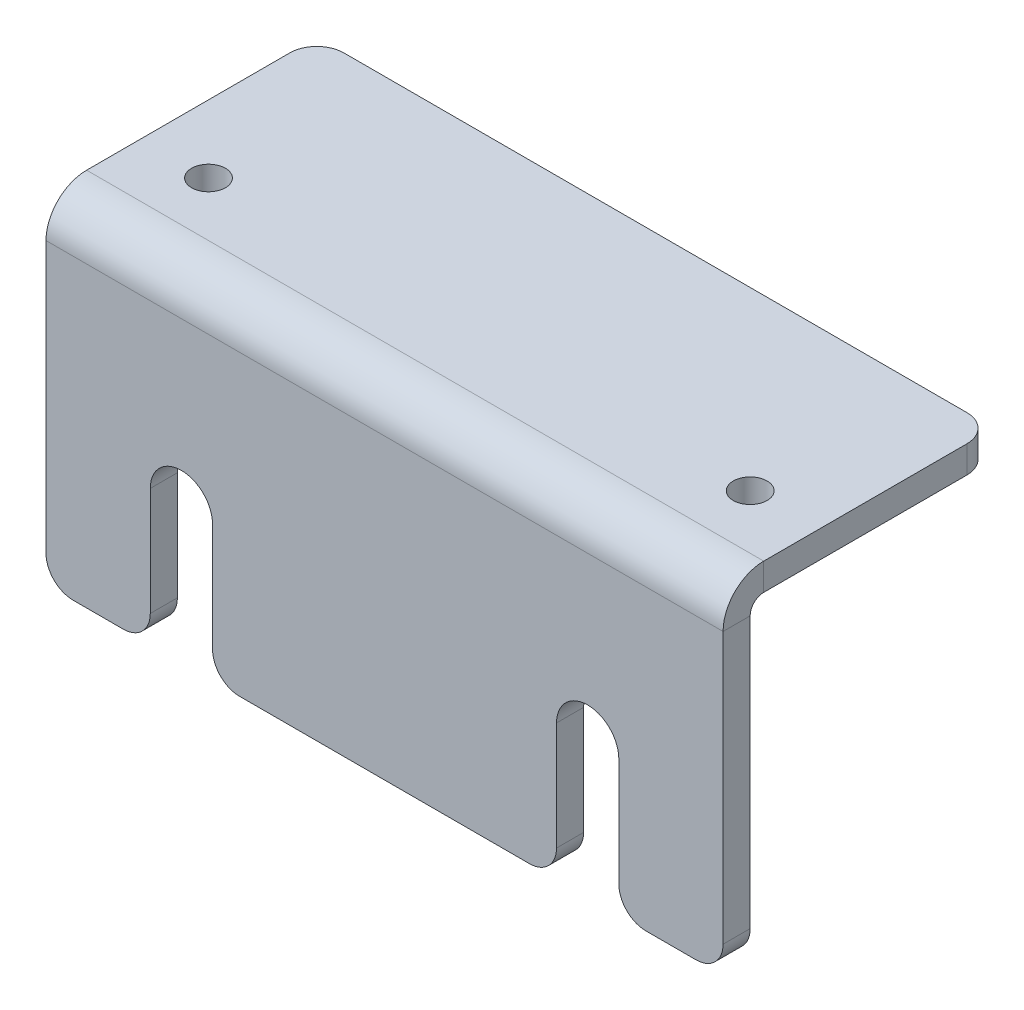
ISO-10303-21;
HEADER;
FILE_DESCRIPTION(('STEP AP214'),'2;1');
FILE_NAME('part.step','',(''),(''),'','','');
FILE_SCHEMA(('AUTOMOTIVE_DESIGN { 1 0 10303 214 1 1 1 1 }'));
ENDSEC;
DATA;
#1=APPLICATION_CONTEXT('core data for automotive mechanical design processes');
#2=APPLICATION_PROTOCOL_DEFINITION('international standard','automotive_design',2000,#1);
#3=PRODUCT_CONTEXT('',#1,'mechanical');
#4=PRODUCT('Part','Part','',(#3));
#5=PRODUCT_RELATED_PRODUCT_CATEGORY('part','',(#4));
#6=PRODUCT_DEFINITION_FORMATION('','',#4);
#7=PRODUCT_DEFINITION_CONTEXT('part definition',#1,'design');
#8=PRODUCT_DEFINITION('design','',#6,#7);
#9=PRODUCT_DEFINITION_SHAPE('','',#8);
#10=(LENGTH_UNIT() NAMED_UNIT(*) SI_UNIT(.MILLI.,.METRE.));
#11=(NAMED_UNIT(*) PLANE_ANGLE_UNIT() SI_UNIT($,.RADIAN.));
#12=(NAMED_UNIT(*) SI_UNIT($,.STERADIAN.) SOLID_ANGLE_UNIT());
#13=UNCERTAINTY_MEASURE_WITH_UNIT(LENGTH_MEASURE(1.E-05),#10,'distance_accuracy_value','');
#14=(GEOMETRIC_REPRESENTATION_CONTEXT(3) GLOBAL_UNCERTAINTY_ASSIGNED_CONTEXT((#13)) GLOBAL_UNIT_ASSIGNED_CONTEXT((#10,
#11,#12)) REPRESENTATION_CONTEXT('',''));
#15=CARTESIAN_POINT('',(0.,0.,0.));
#16=DIRECTION('',(0.,0.,1.));
#17=DIRECTION('',(1.,0.,0.));
#18=AXIS2_PLACEMENT_3D('',#15,#16,#17);
#19=CARTESIAN_POINT('',(-25.,-93.1219674120872,0.));
#20=DIRECTION('',(0.,0.,1.));
#21=DIRECTION('',(0.,-1.,0.));
#22=AXIS2_PLACEMENT_3D('',#19,#20,#21);
#23=PLANE('',#22);
#24=DIRECTION('',(0.,1.,0.));
#25=VECTOR('',#24,1.);
#26=CARTESIAN_POINT('',(-23.,-93.1219674120872,0.));
#27=LINE('',#26,#25);
#28=CARTESIAN_POINT('',(-23.,10.5,0.));
#29=VERTEX_POINT('',#28);
#30=CARTESIAN_POINT('',(-23.,12.5,0.));
#31=VERTEX_POINT('',#30);
#32=EDGE_CURVE('E283',#29,#31,#27,.T.);
#33=ORIENTED_EDGE('',*,*,#32,.T.);
#34=DIRECTION('',(1.,0.,0.));
#35=VECTOR('',#34,1.);
#36=CARTESIAN_POINT('',(-25.,12.5,0.));
#37=LINE('',#36,#35);
#38=CARTESIAN_POINT('',(23.,12.5,0.));
#39=VERTEX_POINT('',#38);
#40=EDGE_CURVE('E308',#31,#39,#37,.T.);
#41=ORIENTED_EDGE('',*,*,#40,.T.);
#42=DIRECTION('',(0.,1.,0.));
#43=VECTOR('',#42,1.);
#44=CARTESIAN_POINT('',(23.,-93.1219674120872,0.));
#45=LINE('',#44,#43);
#46=CARTESIAN_POINT('',(23.,10.5,0.));
#47=VERTEX_POINT('',#46);
#48=EDGE_CURVE('E313',#47,#39,#45,.T.);
#49=ORIENTED_EDGE('',*,*,#48,.F.);
#50=DIRECTION('',(1.,0.,0.));
#51=VECTOR('',#50,1.);
#52=CARTESIAN_POINT('',(-25.,10.5,0.));
#53=LINE('',#52,#51);
#54=EDGE_CURVE('E441',#29,#47,#53,.T.);
#55=ORIENTED_EDGE('',*,*,#54,.F.);
#56=EDGE_LOOP('',(#33,#41,#49,#55));
#57=FACE_BOUND('',#56,.T.);
#58=ADVANCED_FACE('F47',(#57),#23,.F.);
#59=CARTESIAN_POINT('',(23.,-93.1219674120872,2.00000000000001));
#60=DIRECTION('',(0.,1.,0.));
#61=DIRECTION('',(0.,0.,1.));
#62=AXIS2_PLACEMENT_3D('',#59,#60,#61);
#63=CYLINDRICAL_SURFACE('',#62,2.);
#64=ORIENTED_EDGE('',*,*,#48,.T.);
#65=CARTESIAN_POINT('',(23.,12.5,2.00000000000001));
#66=DIRECTION('',(0.,-1.,0.));
#67=DIRECTION('',(0.,0.,-1.));
#68=AXIS2_PLACEMENT_3D('',#65,#66,#67);
#69=CIRCLE('',#68,2.);
#70=CARTESIAN_POINT('',(25.,12.5,2.00000000000001));
#71=VERTEX_POINT('',#70);
#72=EDGE_CURVE('E640',#39,#71,#69,.T.);
#73=ORIENTED_EDGE('',*,*,#72,.T.);
#74=DIRECTION('',(0.,1.,0.));
#75=VECTOR('',#74,1.);
#76=CARTESIAN_POINT('',(25.,-93.1219674120872,2.00000000000001));
#77=LINE('',#76,#75);
#78=CARTESIAN_POINT('',(25.,10.5,2.00000000000001));
#79=VERTEX_POINT('',#78);
#80=EDGE_CURVE('E329',#79,#71,#77,.T.);
#81=ORIENTED_EDGE('',*,*,#80,.F.);
#82=CARTESIAN_POINT('',(23.,10.5,2.00000000000001));
#83=DIRECTION('',(0.,-1.,0.));
#84=DIRECTION('',(0.,0.,-1.));
#85=AXIS2_PLACEMENT_3D('',#82,#83,#84);
#86=CIRCLE('',#85,2.);
#87=EDGE_CURVE('E436',#47,#79,#86,.T.);
#88=ORIENTED_EDGE('',*,*,#87,.F.);
#89=EDGE_LOOP('',(#64,#73,#81,#88));
#90=FACE_BOUND('',#89,.T.);
#91=ADVANCED_FACE('F660',(#90),#63,.T.);
#92=CARTESIAN_POINT('',(20.,12.5,13.));
#93=DIRECTION('',(0.,1.,0.));
#94=DIRECTION('',(0.,0.,1.));
#95=AXIS2_PLACEMENT_3D('',#92,#93,#94);
#96=CYLINDRICAL_SURFACE('',#95,1.25);
#97=CARTESIAN_POINT('',(20.,12.5,13.));
#98=DIRECTION('',(0.,1.,0.));
#99=DIRECTION('',(0.,0.,1.));
#100=AXIS2_PLACEMENT_3D('',#97,#98,#99);
#101=CIRCLE('',#100,1.25);
#102=CARTESIAN_POINT('',(20.,12.5,14.25));
#103=VERTEX_POINT('',#102);
#104=EDGE_CURVE('E346',#103,#103,#101,.T.);
#105=ORIENTED_EDGE('',*,*,#104,.T.);
#106=EDGE_LOOP('',(#105));
#107=FACE_BOUND('',#106,.T.);
#108=CARTESIAN_POINT('',(20.,10.5,13.));
#109=DIRECTION('',(0.,1.,0.));
#110=DIRECTION('',(0.,0.,1.));
#111=AXIS2_PLACEMENT_3D('',#108,#109,#110);
#112=CIRCLE('',#111,1.25);
#113=CARTESIAN_POINT('',(20.,10.5,14.25));
#114=VERTEX_POINT('',#113);
#115=EDGE_CURVE('E328',#114,#114,#112,.T.);
#116=ORIENTED_EDGE('',*,*,#115,.F.);
#117=EDGE_LOOP('',(#116));
#118=FACE_BOUND('',#117,.T.);
#119=ADVANCED_FACE('F646',(#107,#118),#96,.F.);
#120=CARTESIAN_POINT('',(-20.,12.5,13.));
#121=DIRECTION('',(0.,1.,0.));
#122=DIRECTION('',(0.,0.,1.));
#123=AXIS2_PLACEMENT_3D('',#120,#121,#122);
#124=CYLINDRICAL_SURFACE('',#123,1.25);
#125=CARTESIAN_POINT('',(-20.,12.5,13.));
#126=DIRECTION('',(0.,1.,0.));
#127=DIRECTION('',(0.,0.,1.));
#128=AXIS2_PLACEMENT_3D('',#125,#126,#127);
#129=CIRCLE('',#128,1.25);
#130=CARTESIAN_POINT('',(-20.,12.5,14.25));
#131=VERTEX_POINT('',#130);
#132=EDGE_CURVE('E341',#131,#131,#129,.T.);
#133=ORIENTED_EDGE('',*,*,#132,.T.);
#134=EDGE_LOOP('',(#133));
#135=FACE_BOUND('',#134,.T.);
#136=CARTESIAN_POINT('',(-20.,10.5,13.));
#137=DIRECTION('',(0.,1.,0.));
#138=DIRECTION('',(0.,0.,1.));
#139=AXIS2_PLACEMENT_3D('',#136,#137,#138);
#140=CIRCLE('',#139,1.25);
#141=CARTESIAN_POINT('',(-20.,10.5,14.25));
#142=VERTEX_POINT('',#141);
#143=EDGE_CURVE('E323',#142,#142,#140,.T.);
#144=ORIENTED_EDGE('',*,*,#143,.F.);
#145=EDGE_LOOP('',(#144));
#146=FACE_BOUND('',#145,.T.);
#147=ADVANCED_FACE('F672',(#135,#146),#124,.F.);
#148=CARTESIAN_POINT('',(-23.,-93.1219674120872,2.00000000000001));
#149=DIRECTION('',(0.,1.,0.));
#150=DIRECTION('',(0.,0.,1.));
#151=AXIS2_PLACEMENT_3D('',#148,#149,#150);
#152=CYLINDRICAL_SURFACE('',#151,2.);
#153=DIRECTION('',(0.,1.,0.));
#154=VECTOR('',#153,1.);
#155=CARTESIAN_POINT('',(-25.,-93.1219674120872,2.00000000000001));
#156=LINE('',#155,#154);
#157=CARTESIAN_POINT('',(-25.,10.5,2.00000000000001));
#158=VERTEX_POINT('',#157);
#159=CARTESIAN_POINT('',(-25.,12.5,2.00000000000001));
#160=VERTEX_POINT('',#159);
#161=EDGE_CURVE('E338',#158,#160,#156,.T.);
#162=ORIENTED_EDGE('',*,*,#161,.T.);
#163=CARTESIAN_POINT('',(-23.,12.5,2.00000000000001));
#164=DIRECTION('',(0.,1.,0.));
#165=DIRECTION('',(0.,0.,1.));
#166=AXIS2_PLACEMENT_3D('',#163,#164,#165);
#167=CIRCLE('',#166,2.);
#168=EDGE_CURVE('E264',#160,#31,#167,.F.);
#169=ORIENTED_EDGE('',*,*,#168,.T.);
#170=ORIENTED_EDGE('',*,*,#32,.F.);
#171=CARTESIAN_POINT('',(-23.,10.5,2.00000000000001));
#172=DIRECTION('',(0.,1.,0.));
#173=DIRECTION('',(0.,0.,1.));
#174=AXIS2_PLACEMENT_3D('',#171,#172,#173);
#175=CIRCLE('',#174,2.);
#176=EDGE_CURVE('E447',#158,#29,#175,.F.);
#177=ORIENTED_EDGE('',*,*,#176,.F.);
#178=EDGE_LOOP('',(#162,#169,#170,#177));
#179=FACE_BOUND('',#178,.T.);
#180=ADVANCED_FACE('F458',(#179),#152,.T.);
#181=CARTESIAN_POINT('',(-25.,-93.1219674120872,20.));
#182=DIRECTION('',(1.,0.,0.));
#183=DIRECTION('',(0.,-1.,0.));
#184=AXIS2_PLACEMENT_3D('',#181,#182,#183);
#185=PLANE('',#184);
#186=DIRECTION('',(0.,1.,0.));
#187=VECTOR('',#186,1.);
#188=CARTESIAN_POINT('',(-25.,-93.1219674120872,17.));
#189=LINE('',#188,#187);
#190=CARTESIAN_POINT('',(-25.,10.5,17.));
#191=VERTEX_POINT('',#190);
#192=CARTESIAN_POINT('',(-25.,12.5,17.));
#193=VERTEX_POINT('',#192);
#194=EDGE_CURVE('E255',#191,#193,#189,.T.);
#195=ORIENTED_EDGE('',*,*,#194,.T.);
#196=DIRECTION('',(0.,0.,-1.));
#197=VECTOR('',#196,1.);
#198=CARTESIAN_POINT('',(-25.,12.5,20.));
#199=LINE('',#198,#197);
#200=EDGE_CURVE('E258',#160,#193,#199,.F.);
#201=ORIENTED_EDGE('',*,*,#200,.F.);
#202=ORIENTED_EDGE('',*,*,#161,.F.);
#203=DIRECTION('',(0.,0.,-1.));
#204=VECTOR('',#203,1.);
#205=CARTESIAN_POINT('',(-25.,10.5,20.));
#206=LINE('',#205,#204);
#207=EDGE_CURVE('E107',#191,#158,#206,.T.);
#208=ORIENTED_EDGE('',*,*,#207,.F.);
#209=EDGE_LOOP('',(#195,#201,#202,#208));
#210=FACE_BOUND('',#209,.T.);
#211=ADVANCED_FACE('F257',(#210),#185,.F.);
#212=CARTESIAN_POINT('',(-25.,12.5,20.));
#213=DIRECTION('',(0.,-1.,0.));
#214=DIRECTION('',(0.,0.,-1.));
#215=AXIS2_PLACEMENT_3D('',#212,#213,#214);
#216=PLANE('',#215);
#217=ORIENTED_EDGE('',*,*,#132,.F.);
#218=EDGE_LOOP('',(#217));
#219=FACE_BOUND('',#218,.T.);
#220=ORIENTED_EDGE('',*,*,#104,.F.);
#221=EDGE_LOOP('',(#220));
#222=FACE_BOUND('',#221,.T.);
#223=ORIENTED_EDGE('',*,*,#200,.T.);
#224=DIRECTION('',(-1.,0.,0.));
#225=VECTOR('',#224,1.);
#226=CARTESIAN_POINT('',(0.,12.5,17.));
#227=LINE('',#226,#225);
#228=CARTESIAN_POINT('',(25.,12.5,17.));
#229=VERTEX_POINT('',#228);
#230=EDGE_CURVE('E269',#229,#193,#227,.T.);
#231=ORIENTED_EDGE('',*,*,#230,.F.);
#232=DIRECTION('',(0.,0.,1.));
#233=VECTOR('',#232,1.);
#234=CARTESIAN_POINT('',(25.,12.5,20.));
#235=LINE('',#234,#233);
#236=EDGE_CURVE('E272',#229,#71,#235,.F.);
#237=ORIENTED_EDGE('',*,*,#236,.T.);
#238=ORIENTED_EDGE('',*,*,#72,.F.);
#239=ORIENTED_EDGE('',*,*,#40,.F.);
#240=ORIENTED_EDGE('',*,*,#168,.F.);
#241=EDGE_LOOP('',(#223,#231,#237,#238,#239,#240));
#242=FACE_BOUND('',#241,.T.);
#243=ADVANCED_FACE('F268',(#219,#222,#242),#216,.F.);
#244=CARTESIAN_POINT('',(25.,-93.1219674120872,20.));
#245=DIRECTION('',(-1.,0.,0.));
#246=DIRECTION('',(0.,1.,0.));
#247=AXIS2_PLACEMENT_3D('',#244,#245,#246);
#248=PLANE('',#247);
#249=ORIENTED_EDGE('',*,*,#80,.T.);
#250=ORIENTED_EDGE('',*,*,#236,.F.);
#251=DIRECTION('',(0.,1.,0.));
#252=VECTOR('',#251,1.);
#253=CARTESIAN_POINT('',(25.,-93.1219674120872,17.));
#254=LINE('',#253,#252);
#255=CARTESIAN_POINT('',(25.,10.5,17.));
#256=VERTEX_POINT('',#255);
#257=EDGE_CURVE('E51',#256,#229,#254,.T.);
#258=ORIENTED_EDGE('',*,*,#257,.F.);
#259=DIRECTION('',(0.,0.,1.));
#260=VECTOR('',#259,1.);
#261=CARTESIAN_POINT('',(25.,10.5,20.));
#262=LINE('',#261,#260);
#263=EDGE_CURVE('E58',#79,#256,#262,.T.);
#264=ORIENTED_EDGE('',*,*,#263,.F.);
#265=EDGE_LOOP('',(#249,#250,#258,#264));
#266=FACE_BOUND('',#265,.T.);
#267=ADVANCED_FACE('F650',(#266),#248,.F.);
#268=CARTESIAN_POINT('',(-25.,10.5,20.));
#269=DIRECTION('',(0.,-1.,0.));
#270=DIRECTION('',(0.,0.,-1.));
#271=AXIS2_PLACEMENT_3D('',#268,#269,#270);
#272=PLANE('',#271);
#273=ORIENTED_EDGE('',*,*,#143,.T.);
#274=EDGE_LOOP('',(#273));
#275=FACE_BOUND('',#274,.T.);
#276=ORIENTED_EDGE('',*,*,#115,.T.);
#277=EDGE_LOOP('',(#276));
#278=FACE_BOUND('',#277,.T.);
#279=ORIENTED_EDGE('',*,*,#207,.T.);
#280=ORIENTED_EDGE('',*,*,#176,.T.);
#281=ORIENTED_EDGE('',*,*,#54,.T.);
#282=ORIENTED_EDGE('',*,*,#87,.T.);
#283=ORIENTED_EDGE('',*,*,#263,.T.);
#284=DIRECTION('',(1.,0.,0.));
#285=VECTOR('',#284,1.);
#286=CARTESIAN_POINT('',(-25.,10.5,17.));
#287=LINE('',#286,#285);
#288=EDGE_CURVE('E12',#256,#191,#287,.F.);
#289=ORIENTED_EDGE('',*,*,#288,.T.);
#290=EDGE_LOOP('',(#279,#280,#281,#282,#283,#289));
#291=FACE_BOUND('',#290,.T.);
#292=ADVANCED_FACE('F49',(#275,#278,#291),#272,.T.);
#293=CARTESIAN_POINT('',(0.,0.,18.));
#294=DIRECTION('',(0.,0.,-1.));
#295=DIRECTION('',(-1.,0.,0.));
#296=AXIS2_PLACEMENT_3D('',#293,#294,#295);
#297=PLANE('',#296);
#298=DIRECTION('',(0.,1.,0.));
#299=VECTOR('',#298,1.);
#300=CARTESIAN_POINT('',(-25.,-12.5,18.));
#301=LINE('',#300,#299);
#302=CARTESIAN_POINT('',(-25.,-10.5,18.));
#303=VERTEX_POINT('',#302);
#304=CARTESIAN_POINT('',(-25.,9.5,18.));
#305=VERTEX_POINT('',#304);
#306=EDGE_CURVE('E475',#303,#305,#301,.T.);
#307=ORIENTED_EDGE('',*,*,#306,.T.);
#308=DIRECTION('',(-1.,0.,0.));
#309=VECTOR('',#308,1.);
#310=CARTESIAN_POINT('',(0.,9.5,18.));
#311=LINE('',#310,#309);
#312=CARTESIAN_POINT('',(25.,9.5,18.));
#313=VERTEX_POINT('',#312);
#314=EDGE_CURVE('E470',#305,#313,#311,.F.);
#315=ORIENTED_EDGE('',*,*,#314,.T.);
#316=DIRECTION('',(0.,1.,0.));
#317=VECTOR('',#316,1.);
#318=CARTESIAN_POINT('',(25.,-12.5,18.));
#319=LINE('',#318,#317);
#320=CARTESIAN_POINT('',(25.,-10.5,18.));
#321=VERTEX_POINT('',#320);
#322=EDGE_CURVE('E472',#313,#321,#319,.F.);
#323=ORIENTED_EDGE('',*,*,#322,.T.);
#324=CARTESIAN_POINT('',(23.,-10.5,18.));
#325=DIRECTION('',(0.,0.,-1.));
#326=DIRECTION('',(-1.,0.,0.));
#327=AXIS2_PLACEMENT_3D('',#324,#325,#326);
#328=CIRCLE('',#327,2.);
#329=CARTESIAN_POINT('',(23.,-12.5,18.));
#330=VERTEX_POINT('',#329);
#331=EDGE_CURVE('E480',#330,#321,#328,.F.);
#332=ORIENTED_EDGE('',*,*,#331,.F.);
#333=DIRECTION('',(1.,0.,0.));
#334=VECTOR('',#333,1.);
#335=CARTESIAN_POINT('',(-25.,-12.5,18.));
#336=LINE('',#335,#334);
#337=CARTESIAN_POINT('',(19.3,-12.5,18.));
#338=VERTEX_POINT('',#337);
#339=EDGE_CURVE('E483',#330,#338,#336,.F.);
#340=ORIENTED_EDGE('',*,*,#339,.T.);
#341=CARTESIAN_POINT('',(19.3,-10.5,18.));
#342=DIRECTION('',(0.,0.,-1.));
#343=DIRECTION('',(-1.,0.,0.));
#344=AXIS2_PLACEMENT_3D('',#341,#342,#343);
#345=CIRCLE('',#344,2.);
#346=CARTESIAN_POINT('',(17.3,-10.5,18.));
#347=VERTEX_POINT('',#346);
#348=EDGE_CURVE('E489',#347,#338,#345,.F.);
#349=ORIENTED_EDGE('',*,*,#348,.F.);
#350=DIRECTION('',(0.,1.,0.));
#351=VECTOR('',#350,1.);
#352=CARTESIAN_POINT('',(17.3,-22.5,18.));
#353=LINE('',#352,#351);
#354=CARTESIAN_POINT('',(17.3,-2.5,18.));
#355=VERTEX_POINT('',#354);
#356=EDGE_CURVE('E493',#347,#355,#353,.T.);
#357=ORIENTED_EDGE('',*,*,#356,.T.);
#358=CARTESIAN_POINT('',(15.,-2.5,18.));
#359=DIRECTION('',(0.,0.,1.));
#360=DIRECTION('',(1.,0.,0.));
#361=AXIS2_PLACEMENT_3D('',#358,#359,#360);
#362=CIRCLE('',#361,2.3);
#363=CARTESIAN_POINT('',(12.7,-2.5,18.));
#364=VERTEX_POINT('',#363);
#365=EDGE_CURVE('E497',#355,#364,#362,.T.);
#366=ORIENTED_EDGE('',*,*,#365,.T.);
#367=DIRECTION('',(0.,-1.,0.));
#368=VECTOR('',#367,1.);
#369=CARTESIAN_POINT('',(12.7,-22.5,18.));
#370=LINE('',#369,#368);
#371=CARTESIAN_POINT('',(12.7,-10.5,18.));
#372=VERTEX_POINT('',#371);
#373=EDGE_CURVE('E508',#364,#372,#370,.T.);
#374=ORIENTED_EDGE('',*,*,#373,.T.);
#375=CARTESIAN_POINT('',(10.7,-10.5,18.));
#376=DIRECTION('',(0.,0.,1.));
#377=DIRECTION('',(1.,0.,0.));
#378=AXIS2_PLACEMENT_3D('',#375,#376,#377);
#379=CIRCLE('',#378,2.);
#380=CARTESIAN_POINT('',(10.7,-12.5,18.));
#381=VERTEX_POINT('',#380);
#382=EDGE_CURVE('E511',#381,#372,#379,.T.);
#383=ORIENTED_EDGE('',*,*,#382,.F.);
#384=DIRECTION('',(1.,0.,0.));
#385=VECTOR('',#384,1.);
#386=CARTESIAN_POINT('',(-25.,-12.5,18.));
#387=LINE('',#386,#385);
#388=CARTESIAN_POINT('',(-10.7,-12.5,18.));
#389=VERTEX_POINT('',#388);
#390=EDGE_CURVE('E516',#381,#389,#387,.F.);
#391=ORIENTED_EDGE('',*,*,#390,.T.);
#392=CARTESIAN_POINT('',(-10.7,-10.5,18.));
#393=DIRECTION('',(0.,0.,-1.));
#394=DIRECTION('',(-1.,0.,0.));
#395=AXIS2_PLACEMENT_3D('',#392,#393,#394);
#396=CIRCLE('',#395,2.);
#397=CARTESIAN_POINT('',(-12.7,-10.5,18.));
#398=VERTEX_POINT('',#397);
#399=EDGE_CURVE('E519',#398,#389,#396,.F.);
#400=ORIENTED_EDGE('',*,*,#399,.F.);
#401=DIRECTION('',(0.,1.,0.));
#402=VECTOR('',#401,1.);
#403=CARTESIAN_POINT('',(-12.7,-22.5,18.));
#404=LINE('',#403,#402);
#405=CARTESIAN_POINT('',(-12.7,-2.50000000000001,18.));
#406=VERTEX_POINT('',#405);
#407=EDGE_CURVE('E523',#398,#406,#404,.T.);
#408=ORIENTED_EDGE('',*,*,#407,.T.);
#409=CARTESIAN_POINT('',(-15.,-2.50000000000001,18.));
#410=DIRECTION('',(0.,0.,1.));
#411=DIRECTION('',(1.,0.,0.));
#412=AXIS2_PLACEMENT_3D('',#409,#410,#411);
#413=CIRCLE('',#412,2.29999999999999);
#414=CARTESIAN_POINT('',(-17.3,-2.50000000000001,18.));
#415=VERTEX_POINT('',#414);
#416=EDGE_CURVE('E526',#406,#415,#413,.T.);
#417=ORIENTED_EDGE('',*,*,#416,.T.);
#418=DIRECTION('',(0.,1.,0.));
#419=VECTOR('',#418,1.);
#420=CARTESIAN_POINT('',(-17.3,-22.5,18.));
#421=LINE('',#420,#419);
#422=CARTESIAN_POINT('',(-17.3,-10.5,18.));
#423=VERTEX_POINT('',#422);
#424=EDGE_CURVE('E361',#415,#423,#421,.F.);
#425=ORIENTED_EDGE('',*,*,#424,.T.);
#426=CARTESIAN_POINT('',(-19.3,-10.5,18.));
#427=DIRECTION('',(0.,0.,1.));
#428=DIRECTION('',(1.,0.,0.));
#429=AXIS2_PLACEMENT_3D('',#426,#427,#428);
#430=CIRCLE('',#429,2.);
#431=CARTESIAN_POINT('',(-19.3,-12.5,18.));
#432=VERTEX_POINT('',#431);
#433=EDGE_CURVE('E354',#432,#423,#430,.T.);
#434=ORIENTED_EDGE('',*,*,#433,.F.);
#435=DIRECTION('',(1.,0.,0.));
#436=VECTOR('',#435,1.);
#437=CARTESIAN_POINT('',(-25.,-12.5,18.));
#438=LINE('',#437,#436);
#439=CARTESIAN_POINT('',(-23.,-12.5,18.));
#440=VERTEX_POINT('',#439);
#441=EDGE_CURVE('E360',#432,#440,#438,.F.);
#442=ORIENTED_EDGE('',*,*,#441,.T.);
#443=CARTESIAN_POINT('',(-23.,-10.5,18.));
#444=DIRECTION('',(0.,0.,-1.));
#445=DIRECTION('',(-1.,0.,0.));
#446=AXIS2_PLACEMENT_3D('',#443,#444,#445);
#447=CIRCLE('',#446,2.);
#448=EDGE_CURVE('E364',#303,#440,#447,.F.);
#449=ORIENTED_EDGE('',*,*,#448,.F.);
#450=EDGE_LOOP('',(#307,#315,#323,#332,#340,#349,#357,#366,#374,#383,#391,#400,#408,#417,#425,
#434,#442,#449));
#451=FACE_BOUND('',#450,.T.);
#452=ADVANCED_FACE('F471',(#451),#297,.T.);
#453=CARTESIAN_POINT('',(-25.,-12.5,-89.2520022699813));
#454=DIRECTION('',(1.,0.,0.));
#455=DIRECTION('',(0.,0.,-1.));
#456=AXIS2_PLACEMENT_3D('',#453,#454,#455);
#457=PLANE('',#456);
#458=DIRECTION('',(0.,0.,1.));
#459=VECTOR('',#458,1.);
#460=CARTESIAN_POINT('',(-25.,-10.5,-89.2520022699813));
#461=LINE('',#460,#459);
#462=CARTESIAN_POINT('',(-25.,-10.5,20.));
#463=VERTEX_POINT('',#462);
#464=EDGE_CURVE('E368',#303,#463,#461,.T.);
#465=ORIENTED_EDGE('',*,*,#464,.T.);
#466=DIRECTION('',(0.,1.,0.));
#467=VECTOR('',#466,1.);
#468=CARTESIAN_POINT('',(-25.,0.,20.));
#469=LINE('',#468,#467);
#470=CARTESIAN_POINT('',(-25.,9.5,20.));
#471=VERTEX_POINT('',#470);
#472=EDGE_CURVE('E605',#463,#471,#469,.T.);
#473=ORIENTED_EDGE('',*,*,#472,.T.);
#474=DIRECTION('',(0.,0.,1.));
#475=VECTOR('',#474,1.);
#476=CARTESIAN_POINT('',(-25.,9.5,-89.2520022699813));
#477=LINE('',#476,#475);
#478=EDGE_CURVE('E286',#305,#471,#477,.T.);
#479=ORIENTED_EDGE('',*,*,#478,.F.);
#480=ORIENTED_EDGE('',*,*,#306,.F.);
#481=EDGE_LOOP('',(#465,#473,#479,#480));
#482=FACE_BOUND('',#481,.T.);
#483=ADVANCED_FACE('F628',(#482),#457,.F.);
#484=CARTESIAN_POINT('',(25.,-12.5,-89.2520022699813));
#485=DIRECTION('',(-1.,0.,0.));
#486=DIRECTION('',(0.,0.,1.));
#487=AXIS2_PLACEMENT_3D('',#484,#485,#486);
#488=PLANE('',#487);
#489=DIRECTION('',(0.,0.,1.));
#490=VECTOR('',#489,1.);
#491=CARTESIAN_POINT('',(25.,9.5,-89.2520022699813));
#492=LINE('',#491,#490);
#493=CARTESIAN_POINT('',(25.,9.5,20.));
#494=VERTEX_POINT('',#493);
#495=EDGE_CURVE('E429',#313,#494,#492,.T.);
#496=ORIENTED_EDGE('',*,*,#495,.T.);
#497=DIRECTION('',(0.,1.,0.));
#498=VECTOR('',#497,1.);
#499=CARTESIAN_POINT('',(25.,0.,20.));
#500=LINE('',#499,#498);
#501=CARTESIAN_POINT('',(25.,-10.5,20.));
#502=VERTEX_POINT('',#501);
#503=EDGE_CURVE('E117',#494,#502,#500,.F.);
#504=ORIENTED_EDGE('',*,*,#503,.T.);
#505=DIRECTION('',(0.,0.,1.));
#506=VECTOR('',#505,1.);
#507=CARTESIAN_POINT('',(25.,-10.5,-89.2520022699813));
#508=LINE('',#507,#506);
#509=EDGE_CURVE('E426',#321,#502,#508,.T.);
#510=ORIENTED_EDGE('',*,*,#509,.F.);
#511=ORIENTED_EDGE('',*,*,#322,.F.);
#512=EDGE_LOOP('',(#496,#504,#510,#511));
#513=FACE_BOUND('',#512,.T.);
#514=ADVANCED_FACE('F478',(#513),#488,.F.);
#515=CARTESIAN_POINT('',(23.,-10.5,-89.2520022699813));
#516=DIRECTION('',(0.,0.,1.));
#517=DIRECTION('',(1.,0.,0.));
#518=AXIS2_PLACEMENT_3D('',#515,#516,#517);
#519=CYLINDRICAL_SURFACE('',#518,2.);
#520=CARTESIAN_POINT('',(23.,-10.5,20.));
#521=DIRECTION('',(0.,0.,-1.));
#522=DIRECTION('',(-1.,0.,0.));
#523=AXIS2_PLACEMENT_3D('',#520,#521,#522);
#524=CIRCLE('',#523,2.);
#525=CARTESIAN_POINT('',(23.,-12.5,20.));
#526=VERTEX_POINT('',#525);
#527=EDGE_CURVE('E125',#502,#526,#524,.T.);
#528=ORIENTED_EDGE('',*,*,#527,.T.);
#529=DIRECTION('',(0.,0.,1.));
#530=VECTOR('',#529,1.);
#531=CARTESIAN_POINT('',(23.,-12.5,-89.2520022699813));
#532=LINE('',#531,#530);
#533=EDGE_CURVE('E423',#330,#526,#532,.T.);
#534=ORIENTED_EDGE('',*,*,#533,.F.);
#535=ORIENTED_EDGE('',*,*,#331,.T.);
#536=ORIENTED_EDGE('',*,*,#509,.T.);
#537=EDGE_LOOP('',(#528,#534,#535,#536));
#538=FACE_BOUND('',#537,.T.);
#539=ADVANCED_FACE('F727',(#538),#519,.T.);
#540=CARTESIAN_POINT('',(-25.,-12.5,-89.2520022699813));
#541=DIRECTION('',(0.,1.,0.));
#542=DIRECTION('',(0.,0.,1.));
#543=AXIS2_PLACEMENT_3D('',#540,#541,#542);
#544=PLANE('',#543);
#545=ORIENTED_EDGE('',*,*,#533,.T.);
#546=DIRECTION('',(-1.,0.,0.));
#547=VECTOR('',#546,1.);
#548=CARTESIAN_POINT('',(0.,-12.5,20.));
#549=LINE('',#548,#547);
#550=CARTESIAN_POINT('',(19.3,-12.5,20.));
#551=VERTEX_POINT('',#550);
#552=EDGE_CURVE('E593',#526,#551,#549,.T.);
#553=ORIENTED_EDGE('',*,*,#552,.T.);
#554=DIRECTION('',(0.,0.,1.));
#555=VECTOR('',#554,1.);
#556=CARTESIAN_POINT('',(19.3,-12.5,-89.2520022699813));
#557=LINE('',#556,#555);
#558=EDGE_CURVE('E419',#338,#551,#557,.T.);
#559=ORIENTED_EDGE('',*,*,#558,.F.);
#560=ORIENTED_EDGE('',*,*,#339,.F.);
#561=EDGE_LOOP('',(#545,#553,#559,#560));
#562=FACE_BOUND('',#561,.T.);
#563=ADVANCED_FACE('F735',(#562),#544,.F.);
#564=CARTESIAN_POINT('',(19.3,-10.5,-89.2520022699813));
#565=DIRECTION('',(0.,0.,1.));
#566=DIRECTION('',(1.,0.,0.));
#567=AXIS2_PLACEMENT_3D('',#564,#565,#566);
#568=CYLINDRICAL_SURFACE('',#567,2.);
#569=CARTESIAN_POINT('',(19.3,-10.5,20.));
#570=DIRECTION('',(0.,0.,-1.));
#571=DIRECTION('',(-1.,0.,0.));
#572=AXIS2_PLACEMENT_3D('',#569,#570,#571);
#573=CIRCLE('',#572,2.);
#574=CARTESIAN_POINT('',(17.3,-10.5,20.));
#575=VERTEX_POINT('',#574);
#576=EDGE_CURVE('E590',#551,#575,#573,.T.);
#577=ORIENTED_EDGE('',*,*,#576,.T.);
#578=DIRECTION('',(0.,0.,1.));
#579=VECTOR('',#578,1.);
#580=CARTESIAN_POINT('',(17.3,-10.5,-89.2520022699813));
#581=LINE('',#580,#579);
#582=EDGE_CURVE('E415',#347,#575,#581,.T.);
#583=ORIENTED_EDGE('',*,*,#582,.F.);
#584=ORIENTED_EDGE('',*,*,#348,.T.);
#585=ORIENTED_EDGE('',*,*,#558,.T.);
#586=EDGE_LOOP('',(#577,#583,#584,#585));
#587=FACE_BOUND('',#586,.T.);
#588=ADVANCED_FACE('F744',(#587),#568,.T.);
#589=CARTESIAN_POINT('',(17.3,-22.5,-89.2520022699813));
#590=DIRECTION('',(1.,0.,0.));
#591=DIRECTION('',(0.,0.,-1.));
#592=AXIS2_PLACEMENT_3D('',#589,#590,#591);
#593=PLANE('',#592);
#594=ORIENTED_EDGE('',*,*,#582,.T.);
#595=DIRECTION('',(0.,1.,0.));
#596=VECTOR('',#595,1.);
#597=CARTESIAN_POINT('',(17.3,0.,20.));
#598=LINE('',#597,#596);
#599=CARTESIAN_POINT('',(17.3,-2.5,20.));
#600=VERTEX_POINT('',#599);
#601=EDGE_CURVE('E292',#575,#600,#598,.T.);
#602=ORIENTED_EDGE('',*,*,#601,.T.);
#603=DIRECTION('',(0.,0.,1.));
#604=VECTOR('',#603,1.);
#605=CARTESIAN_POINT('',(17.3,-2.5,-89.2520022699813));
#606=LINE('',#605,#604);
#607=EDGE_CURVE('E411',#355,#600,#606,.T.);
#608=ORIENTED_EDGE('',*,*,#607,.F.);
#609=ORIENTED_EDGE('',*,*,#356,.F.);
#610=EDGE_LOOP('',(#594,#602,#608,#609));
#611=FACE_BOUND('',#610,.T.);
#612=ADVANCED_FACE('F754',(#611),#593,.F.);
#613=CARTESIAN_POINT('',(15.,-2.5,-89.2520022699813));
#614=DIRECTION('',(0.,0.,1.));
#615=DIRECTION('',(1.,0.,0.));
#616=AXIS2_PLACEMENT_3D('',#613,#614,#615);
#617=CYLINDRICAL_SURFACE('',#616,2.3);
#618=ORIENTED_EDGE('',*,*,#607,.T.);
#619=CARTESIAN_POINT('',(15.,-2.5,20.));
#620=DIRECTION('',(0.,0.,1.));
#621=DIRECTION('',(1.,0.,0.));
#622=AXIS2_PLACEMENT_3D('',#619,#620,#621);
#623=CIRCLE('',#622,2.3);
#624=CARTESIAN_POINT('',(12.7,-2.5,20.));
#625=VERTEX_POINT('',#624);
#626=EDGE_CURVE('E578',#600,#625,#623,.T.);
#627=ORIENTED_EDGE('',*,*,#626,.T.);
#628=DIRECTION('',(0.,0.,1.));
#629=VECTOR('',#628,1.);
#630=CARTESIAN_POINT('',(12.7,-2.5,-89.2520022699813));
#631=LINE('',#630,#629);
#632=EDGE_CURVE('E407',#364,#625,#631,.T.);
#633=ORIENTED_EDGE('',*,*,#632,.F.);
#634=ORIENTED_EDGE('',*,*,#365,.F.);
#635=EDGE_LOOP('',(#618,#627,#633,#634));
#636=FACE_BOUND('',#635,.T.);
#637=ADVANCED_FACE('F764',(#636),#617,.F.);
#638=CARTESIAN_POINT('',(12.7,-22.5,-89.2520022699813));
#639=DIRECTION('',(-1.,0.,0.));
#640=DIRECTION('',(0.,-1.,0.));
#641=AXIS2_PLACEMENT_3D('',#638,#639,#640);
#642=PLANE('',#641);
#643=ORIENTED_EDGE('',*,*,#632,.T.);
#644=DIRECTION('',(0.,1.,0.));
#645=VECTOR('',#644,1.);
#646=CARTESIAN_POINT('',(12.7,0.,20.));
#647=LINE('',#646,#645);
#648=CARTESIAN_POINT('',(12.7,-10.5,20.));
#649=VERTEX_POINT('',#648);
#650=EDGE_CURVE('E576',#625,#649,#647,.F.);
#651=ORIENTED_EDGE('',*,*,#650,.T.);
#652=DIRECTION('',(0.,0.,1.));
#653=VECTOR('',#652,1.);
#654=CARTESIAN_POINT('',(12.7,-10.5,-89.2520022699813));
#655=LINE('',#654,#653);
#656=EDGE_CURVE('E403',#372,#649,#655,.T.);
#657=ORIENTED_EDGE('',*,*,#656,.F.);
#658=ORIENTED_EDGE('',*,*,#373,.F.);
#659=EDGE_LOOP('',(#643,#651,#657,#658));
#660=FACE_BOUND('',#659,.T.);
#661=ADVANCED_FACE('F774',(#660),#642,.F.);
#662=CARTESIAN_POINT('',(10.7,-10.5,-89.2520022699813));
#663=DIRECTION('',(0.,0.,1.));
#664=DIRECTION('',(1.,0.,0.));
#665=AXIS2_PLACEMENT_3D('',#662,#663,#664);
#666=CYLINDRICAL_SURFACE('',#665,2.);
#667=CARTESIAN_POINT('',(10.7,-10.5,20.));
#668=DIRECTION('',(0.,0.,1.));
#669=DIRECTION('',(1.,0.,0.));
#670=AXIS2_PLACEMENT_3D('',#667,#668,#669);
#671=CIRCLE('',#670,2.);
#672=CARTESIAN_POINT('',(10.7,-12.5,20.));
#673=VERTEX_POINT('',#672);
#674=EDGE_CURVE('E573',#649,#673,#671,.F.);
#675=ORIENTED_EDGE('',*,*,#674,.T.);
#676=DIRECTION('',(0.,0.,1.));
#677=VECTOR('',#676,1.);
#678=CARTESIAN_POINT('',(10.7,-12.5,-89.2520022699813));
#679=LINE('',#678,#677);
#680=EDGE_CURVE('E399',#381,#673,#679,.T.);
#681=ORIENTED_EDGE('',*,*,#680,.F.);
#682=ORIENTED_EDGE('',*,*,#382,.T.);
#683=ORIENTED_EDGE('',*,*,#656,.T.);
#684=EDGE_LOOP('',(#675,#681,#682,#683));
#685=FACE_BOUND('',#684,.T.);
#686=ADVANCED_FACE('F784',(#685),#666,.T.);
#687=CARTESIAN_POINT('',(-25.,-12.5,-89.2520022699813));
#688=DIRECTION('',(0.,1.,0.));
#689=DIRECTION('',(0.,0.,1.));
#690=AXIS2_PLACEMENT_3D('',#687,#688,#689);
#691=PLANE('',#690);
#692=ORIENTED_EDGE('',*,*,#680,.T.);
#693=DIRECTION('',(-1.,0.,0.));
#694=VECTOR('',#693,1.);
#695=CARTESIAN_POINT('',(0.,-12.5,20.));
#696=LINE('',#695,#694);
#697=CARTESIAN_POINT('',(-10.7,-12.5,20.));
#698=VERTEX_POINT('',#697);
#699=EDGE_CURVE('E569',#673,#698,#696,.T.);
#700=ORIENTED_EDGE('',*,*,#699,.T.);
#701=DIRECTION('',(0.,0.,1.));
#702=VECTOR('',#701,1.);
#703=CARTESIAN_POINT('',(-10.7,-12.5,-89.2520022699813));
#704=LINE('',#703,#702);
#705=EDGE_CURVE('E395',#389,#698,#704,.T.);
#706=ORIENTED_EDGE('',*,*,#705,.F.);
#707=ORIENTED_EDGE('',*,*,#390,.F.);
#708=EDGE_LOOP('',(#692,#700,#706,#707));
#709=FACE_BOUND('',#708,.T.);
#710=ADVANCED_FACE('F794',(#709),#691,.F.);
#711=CARTESIAN_POINT('',(-10.7,-10.5,-89.2520022699813));
#712=DIRECTION('',(0.,0.,1.));
#713=DIRECTION('',(1.,0.,0.));
#714=AXIS2_PLACEMENT_3D('',#711,#712,#713);
#715=CYLINDRICAL_SURFACE('',#714,2.);
#716=CARTESIAN_POINT('',(-10.7,-10.5,20.));
#717=DIRECTION('',(0.,0.,-1.));
#718=DIRECTION('',(-1.,0.,0.));
#719=AXIS2_PLACEMENT_3D('',#716,#717,#718);
#720=CIRCLE('',#719,2.);
#721=CARTESIAN_POINT('',(-12.7,-10.5,20.));
#722=VERTEX_POINT('',#721);
#723=EDGE_CURVE('E566',#698,#722,#720,.T.);
#724=ORIENTED_EDGE('',*,*,#723,.T.);
#725=DIRECTION('',(0.,0.,1.));
#726=VECTOR('',#725,1.);
#727=CARTESIAN_POINT('',(-12.7,-10.5,-89.2520022699813));
#728=LINE('',#727,#726);
#729=EDGE_CURVE('E391',#398,#722,#728,.T.);
#730=ORIENTED_EDGE('',*,*,#729,.F.);
#731=ORIENTED_EDGE('',*,*,#399,.T.);
#732=ORIENTED_EDGE('',*,*,#705,.T.);
#733=EDGE_LOOP('',(#724,#730,#731,#732));
#734=FACE_BOUND('',#733,.T.);
#735=ADVANCED_FACE('F804',(#734),#715,.T.);
#736=CARTESIAN_POINT('',(-12.7,-22.5,-89.2520022699813));
#737=DIRECTION('',(1.,0.,0.));
#738=DIRECTION('',(0.,1.,0.));
#739=AXIS2_PLACEMENT_3D('',#736,#737,#738);
#740=PLANE('',#739);
#741=ORIENTED_EDGE('',*,*,#729,.T.);
#742=DIRECTION('',(0.,1.,0.));
#743=VECTOR('',#742,1.);
#744=CARTESIAN_POINT('',(-12.7,0.,20.));
#745=LINE('',#744,#743);
#746=CARTESIAN_POINT('',(-12.7,-2.50000000000001,20.));
#747=VERTEX_POINT('',#746);
#748=EDGE_CURVE('E551',#722,#747,#745,.T.);
#749=ORIENTED_EDGE('',*,*,#748,.T.);
#750=DIRECTION('',(0.,0.,1.));
#751=VECTOR('',#750,1.);
#752=CARTESIAN_POINT('',(-12.7,-2.50000000000001,-89.2520022699813));
#753=LINE('',#752,#751);
#754=EDGE_CURVE('E387',#406,#747,#753,.T.);
#755=ORIENTED_EDGE('',*,*,#754,.F.);
#756=ORIENTED_EDGE('',*,*,#407,.F.);
#757=EDGE_LOOP('',(#741,#749,#755,#756));
#758=FACE_BOUND('',#757,.T.);
#759=ADVANCED_FACE('F814',(#758),#740,.F.);
#760=CARTESIAN_POINT('',(-15.,-2.50000000000001,-89.2520022699813));
#761=DIRECTION('',(0.,0.,1.));
#762=DIRECTION('',(1.,0.,0.));
#763=AXIS2_PLACEMENT_3D('',#760,#761,#762);
#764=CYLINDRICAL_SURFACE('',#763,2.29999999999999);
#765=ORIENTED_EDGE('',*,*,#754,.T.);
#766=CARTESIAN_POINT('',(-15.,-2.50000000000001,20.));
#767=DIRECTION('',(0.,0.,1.));
#768=DIRECTION('',(1.,0.,0.));
#769=AXIS2_PLACEMENT_3D('',#766,#767,#768);
#770=CIRCLE('',#769,2.29999999999999);
#771=CARTESIAN_POINT('',(-17.3,-2.50000000000001,20.));
#772=VERTEX_POINT('',#771);
#773=EDGE_CURVE('E546',#747,#772,#770,.T.);
#774=ORIENTED_EDGE('',*,*,#773,.T.);
#775=DIRECTION('',(0.,0.,1.));
#776=VECTOR('',#775,1.);
#777=CARTESIAN_POINT('',(-17.3,-2.50000000000001,-89.2520022699813));
#778=LINE('',#777,#776);
#779=EDGE_CURVE('E383',#415,#772,#778,.T.);
#780=ORIENTED_EDGE('',*,*,#779,.F.);
#781=ORIENTED_EDGE('',*,*,#416,.F.);
#782=EDGE_LOOP('',(#765,#774,#780,#781));
#783=FACE_BOUND('',#782,.T.);
#784=ADVANCED_FACE('F824',(#783),#764,.F.);
#785=CARTESIAN_POINT('',(-17.3,-22.5,-89.2520022699813));
#786=DIRECTION('',(-1.,0.,0.));
#787=DIRECTION('',(0.,0.,1.));
#788=AXIS2_PLACEMENT_3D('',#785,#786,#787);
#789=PLANE('',#788);
#790=ORIENTED_EDGE('',*,*,#779,.T.);
#791=DIRECTION('',(0.,1.,0.));
#792=VECTOR('',#791,1.);
#793=CARTESIAN_POINT('',(-17.3,0.,20.));
#794=LINE('',#793,#792);
#795=CARTESIAN_POINT('',(-17.3,-10.5,20.));
#796=VERTEX_POINT('',#795);
#797=EDGE_CURVE('E542',#772,#796,#794,.F.);
#798=ORIENTED_EDGE('',*,*,#797,.T.);
#799=DIRECTION('',(0.,0.,1.));
#800=VECTOR('',#799,1.);
#801=CARTESIAN_POINT('',(-17.3,-10.5,-89.2520022699813));
#802=LINE('',#801,#800);
#803=EDGE_CURVE('E379',#423,#796,#802,.T.);
#804=ORIENTED_EDGE('',*,*,#803,.F.);
#805=ORIENTED_EDGE('',*,*,#424,.F.);
#806=EDGE_LOOP('',(#790,#798,#804,#805));
#807=FACE_BOUND('',#806,.T.);
#808=ADVANCED_FACE('F540',(#807),#789,.F.);
#809=CARTESIAN_POINT('',(-19.3,-10.5,-89.2520022699813));
#810=DIRECTION('',(0.,0.,1.));
#811=DIRECTION('',(1.,0.,0.));
#812=AXIS2_PLACEMENT_3D('',#809,#810,#811);
#813=CYLINDRICAL_SURFACE('',#812,2.);
#814=CARTESIAN_POINT('',(-19.3,-10.5,20.));
#815=DIRECTION('',(0.,0.,1.));
#816=DIRECTION('',(1.,0.,0.));
#817=AXIS2_PLACEMENT_3D('',#814,#815,#816);
#818=CIRCLE('',#817,2.);
#819=CARTESIAN_POINT('',(-19.3,-12.5,20.));
#820=VERTEX_POINT('',#819);
#821=EDGE_CURVE('E547',#796,#820,#818,.F.);
#822=ORIENTED_EDGE('',*,*,#821,.T.);
#823=DIRECTION('',(0.,0.,1.));
#824=VECTOR('',#823,1.);
#825=CARTESIAN_POINT('',(-19.3,-12.5,-89.2520022699813));
#826=LINE('',#825,#824);
#827=EDGE_CURVE('E375',#432,#820,#826,.T.);
#828=ORIENTED_EDGE('',*,*,#827,.F.);
#829=ORIENTED_EDGE('',*,*,#433,.T.);
#830=ORIENTED_EDGE('',*,*,#803,.T.);
#831=EDGE_LOOP('',(#822,#828,#829,#830));
#832=FACE_BOUND('',#831,.T.);
#833=ADVANCED_FACE('F538',(#832),#813,.T.);
#834=CARTESIAN_POINT('',(-25.,-12.5,-89.2520022699813));
#835=DIRECTION('',(0.,1.,0.));
#836=DIRECTION('',(0.,0.,1.));
#837=AXIS2_PLACEMENT_3D('',#834,#835,#836);
#838=PLANE('',#837);
#839=ORIENTED_EDGE('',*,*,#827,.T.);
#840=DIRECTION('',(-1.,0.,0.));
#841=VECTOR('',#840,1.);
#842=CARTESIAN_POINT('',(0.,-12.5,20.));
#843=LINE('',#842,#841);
#844=CARTESIAN_POINT('',(-23.,-12.5,20.));
#845=VERTEX_POINT('',#844);
#846=EDGE_CURVE('E553',#820,#845,#843,.T.);
#847=ORIENTED_EDGE('',*,*,#846,.T.);
#848=DIRECTION('',(0.,0.,1.));
#849=VECTOR('',#848,1.);
#850=CARTESIAN_POINT('',(-23.,-12.5,-89.2520022699813));
#851=LINE('',#850,#849);
#852=EDGE_CURVE('E372',#440,#845,#851,.T.);
#853=ORIENTED_EDGE('',*,*,#852,.F.);
#854=ORIENTED_EDGE('',*,*,#441,.F.);
#855=EDGE_LOOP('',(#839,#847,#853,#854));
#856=FACE_BOUND('',#855,.T.);
#857=ADVANCED_FACE('F619',(#856),#838,.F.);
#858=CARTESIAN_POINT('',(-23.,-10.5,-89.2520022699813));
#859=DIRECTION('',(0.,0.,1.));
#860=DIRECTION('',(1.,0.,0.));
#861=AXIS2_PLACEMENT_3D('',#858,#859,#860);
#862=CYLINDRICAL_SURFACE('',#861,2.);
#863=CARTESIAN_POINT('',(-23.,-10.5,20.));
#864=DIRECTION('',(0.,0.,-1.));
#865=DIRECTION('',(-1.,0.,0.));
#866=AXIS2_PLACEMENT_3D('',#863,#864,#865);
#867=CIRCLE('',#866,2.);
#868=EDGE_CURVE('E608',#845,#463,#867,.T.);
#869=ORIENTED_EDGE('',*,*,#868,.T.);
#870=ORIENTED_EDGE('',*,*,#464,.F.);
#871=ORIENTED_EDGE('',*,*,#448,.T.);
#872=ORIENTED_EDGE('',*,*,#852,.T.);
#873=EDGE_LOOP('',(#869,#870,#871,#872));
#874=FACE_BOUND('',#873,.T.);
#875=ADVANCED_FACE('F626',(#874),#862,.T.);
#876=CARTESIAN_POINT('',(0.,0.,20.));
#877=DIRECTION('',(0.,0.,-1.));
#878=DIRECTION('',(-1.,0.,0.));
#879=AXIS2_PLACEMENT_3D('',#876,#877,#878);
#880=PLANE('',#879);
#881=ORIENTED_EDGE('',*,*,#601,.F.);
#882=ORIENTED_EDGE('',*,*,#576,.F.);
#883=ORIENTED_EDGE('',*,*,#552,.F.);
#884=ORIENTED_EDGE('',*,*,#527,.F.);
#885=ORIENTED_EDGE('',*,*,#503,.F.);
#886=DIRECTION('',(-1.,0.,0.));
#887=VECTOR('',#886,1.);
#888=CARTESIAN_POINT('',(0.,9.5,20.));
#889=LINE('',#888,#887);
#890=EDGE_CURVE('E609',#471,#494,#889,.F.);
#891=ORIENTED_EDGE('',*,*,#890,.F.);
#892=ORIENTED_EDGE('',*,*,#472,.F.);
#893=ORIENTED_EDGE('',*,*,#868,.F.);
#894=ORIENTED_EDGE('',*,*,#846,.F.);
#895=ORIENTED_EDGE('',*,*,#821,.F.);
#896=ORIENTED_EDGE('',*,*,#797,.F.);
#897=ORIENTED_EDGE('',*,*,#773,.F.);
#898=ORIENTED_EDGE('',*,*,#748,.F.);
#899=ORIENTED_EDGE('',*,*,#723,.F.);
#900=ORIENTED_EDGE('',*,*,#699,.F.);
#901=ORIENTED_EDGE('',*,*,#674,.F.);
#902=ORIENTED_EDGE('',*,*,#650,.F.);
#903=ORIENTED_EDGE('',*,*,#626,.F.);
#904=EDGE_LOOP('',(#881,#882,#883,#884,#885,#891,#892,#893,#894,#895,#896,#897,#898,#899,#900,
#901,#902,#903));
#905=FACE_BOUND('',#904,.T.);
#906=ADVANCED_FACE('F622',(#905),#880,.F.);
#907=CARTESIAN_POINT('',(25.,9.5,17.));
#908=DIRECTION('',(1.,0.,0.));
#909=DIRECTION('',(0.,0.,-1.));
#910=AXIS2_PLACEMENT_3D('',#907,#908,#909);
#911=PLANE('',#910);
#912=ORIENTED_EDGE('',*,*,#495,.F.);
#913=CARTESIAN_POINT('',(25.,9.5,17.));
#914=DIRECTION('',(1.,0.,0.));
#915=DIRECTION('',(0.,0.,-1.));
#916=AXIS2_PLACEMENT_3D('',#913,#914,#915);
#917=CIRCLE('',#916,1.);
#918=EDGE_CURVE('E288',#313,#256,#917,.F.);
#919=ORIENTED_EDGE('',*,*,#918,.T.);
#920=ORIENTED_EDGE('',*,*,#257,.T.);
#921=CARTESIAN_POINT('',(25.,9.5,17.));
#922=DIRECTION('',(1.,0.,0.));
#923=DIRECTION('',(0.,0.,-1.));
#924=AXIS2_PLACEMENT_3D('',#921,#922,#923);
#925=CIRCLE('',#924,2.99999999999998);
#926=EDGE_CURVE('E281',#494,#229,#925,.F.);
#927=ORIENTED_EDGE('',*,*,#926,.F.);
#928=EDGE_LOOP('',(#912,#919,#920,#927));
#929=FACE_BOUND('',#928,.T.);
#930=ADVANCED_FACE('F465',(#929),#911,.T.);
#931=CARTESIAN_POINT('',(-25.,9.5,17.));
#932=DIRECTION('',(-1.,0.,0.));
#933=DIRECTION('',(0.,-1.,0.));
#934=AXIS2_PLACEMENT_3D('',#931,#932,#933);
#935=PLANE('',#934);
#936=ORIENTED_EDGE('',*,*,#194,.F.);
#937=CARTESIAN_POINT('',(-25.,9.5,17.));
#938=DIRECTION('',(1.,0.,0.));
#939=DIRECTION('',(0.,0.,-1.));
#940=AXIS2_PLACEMENT_3D('',#937,#938,#939);
#941=CIRCLE('',#940,1.);
#942=EDGE_CURVE('E295',#191,#305,#941,.T.);
#943=ORIENTED_EDGE('',*,*,#942,.T.);
#944=ORIENTED_EDGE('',*,*,#478,.T.);
#945=CARTESIAN_POINT('',(-25.,9.5,17.));
#946=DIRECTION('',(1.,0.,0.));
#947=DIRECTION('',(0.,0.,-1.));
#948=AXIS2_PLACEMENT_3D('',#945,#946,#947);
#949=CIRCLE('',#948,2.99999999999998);
#950=EDGE_CURVE('E279',#193,#471,#949,.T.);
#951=ORIENTED_EDGE('',*,*,#950,.F.);
#952=EDGE_LOOP('',(#936,#943,#944,#951));
#953=FACE_BOUND('',#952,.T.);
#954=ADVANCED_FACE('F284',(#953),#935,.T.);
#955=CARTESIAN_POINT('',(-90.0734969092641,9.5,17.));
#956=DIRECTION('',(1.,0.,0.));
#957=DIRECTION('',(0.,0.,-1.));
#958=AXIS2_PLACEMENT_3D('',#955,#956,#957);
#959=CYLINDRICAL_SURFACE('',#958,2.99999999999998);
#960=ORIENTED_EDGE('',*,*,#950,.T.);
#961=ORIENTED_EDGE('',*,*,#890,.T.);
#962=ORIENTED_EDGE('',*,*,#926,.T.);
#963=ORIENTED_EDGE('',*,*,#230,.T.);
#964=EDGE_LOOP('',(#960,#961,#962,#963));
#965=FACE_BOUND('',#964,.T.);
#966=ADVANCED_FACE('F277',(#965),#959,.T.);
#967=CARTESIAN_POINT('',(-90.0734969092641,9.5,17.));
#968=DIRECTION('',(1.,0.,0.));
#969=DIRECTION('',(0.,0.,-1.));
#970=AXIS2_PLACEMENT_3D('',#967,#968,#969);
#971=CYLINDRICAL_SURFACE('',#970,1.);
#972=ORIENTED_EDGE('',*,*,#942,.F.);
#973=ORIENTED_EDGE('',*,*,#288,.F.);
#974=ORIENTED_EDGE('',*,*,#918,.F.);
#975=ORIENTED_EDGE('',*,*,#314,.F.);
#976=EDGE_LOOP('',(#972,#973,#974,#975));
#977=FACE_BOUND('',#976,.T.);
#978=ADVANCED_FACE('F461',(#977),#971,.F.);
#979=CLOSED_SHELL('',(#58,#91,#119,#147,#180,#211,#243,#267,#292,#452,#483,#514,#539,#563,#588,
#612,#637,#661,#686,#710,#735,#759,#784,#808,#833,#857,#875,#906,#930,#954,#966,#978));
#980=MANIFOLD_SOLID_BREP('B2',#979);
#981=ADVANCED_BREP_SHAPE_REPRESENTATION('',(#18,#980),#14);
#982=SHAPE_DEFINITION_REPRESENTATION(#9,#981);
ENDSEC;
END-ISO-10303-21;
